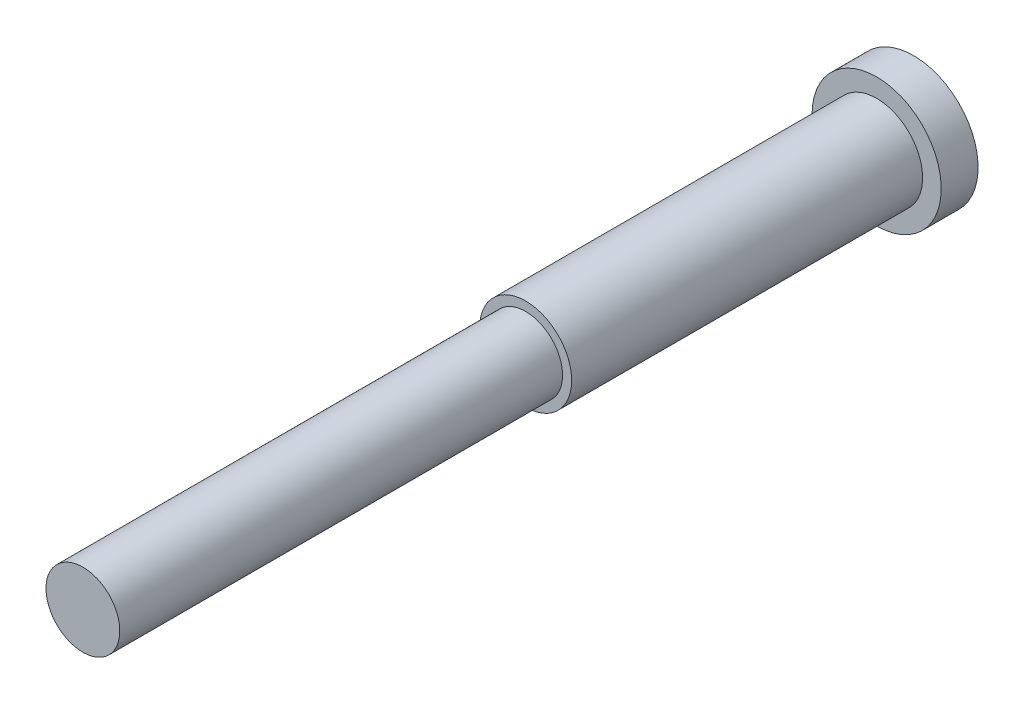
ISO-10303-21;
HEADER;
FILE_DESCRIPTION(('STEP AP214'),'2;1');
FILE_NAME('part.step','',(''),(''),'','','');
FILE_SCHEMA(('AUTOMOTIVE_DESIGN { 1 0 10303 214 1 1 1 1 }'));
ENDSEC;
DATA;
#1=APPLICATION_CONTEXT('core data for automotive mechanical design processes');
#2=APPLICATION_PROTOCOL_DEFINITION('international standard','automotive_design',2000,#1);
#3=PRODUCT_CONTEXT('',#1,'mechanical');
#4=PRODUCT('Part','Part','',(#3));
#5=PRODUCT_RELATED_PRODUCT_CATEGORY('part','',(#4));
#6=PRODUCT_DEFINITION_FORMATION('','',#4);
#7=PRODUCT_DEFINITION_CONTEXT('part definition',#1,'design');
#8=PRODUCT_DEFINITION('design','',#6,#7);
#9=PRODUCT_DEFINITION_SHAPE('','',#8);
#10=(LENGTH_UNIT() NAMED_UNIT(*) SI_UNIT(.MILLI.,.METRE.));
#11=(NAMED_UNIT(*) PLANE_ANGLE_UNIT() SI_UNIT($,.RADIAN.));
#12=(NAMED_UNIT(*) SI_UNIT($,.STERADIAN.) SOLID_ANGLE_UNIT());
#13=UNCERTAINTY_MEASURE_WITH_UNIT(LENGTH_MEASURE(1.E-05),#10,'distance_accuracy_value','');
#14=(GEOMETRIC_REPRESENTATION_CONTEXT(3) GLOBAL_UNCERTAINTY_ASSIGNED_CONTEXT((#13)) GLOBAL_UNIT_ASSIGNED_CONTEXT((#10,
#11,#12)) REPRESENTATION_CONTEXT('',''));
#15=CARTESIAN_POINT('',(0.,0.,0.));
#16=DIRECTION('',(0.,0.,1.));
#17=DIRECTION('',(1.,0.,0.));
#18=AXIS2_PLACEMENT_3D('',#15,#16,#17);
#19=CARTESIAN_POINT('',(0.,0.,60.4012));
#20=DIRECTION('',(0.,0.,1.));
#21=DIRECTION('',(1.,0.,0.));
#22=AXIS2_PLACEMENT_3D('',#19,#20,#21);
#23=PLANE('',#22);
#24=CARTESIAN_POINT('',(0.,0.,60.4012));
#25=DIRECTION('',(0.,0.,1.));
#26=DIRECTION('',(1.,0.,0.));
#27=AXIS2_PLACEMENT_3D('',#24,#25,#26);
#28=CIRCLE('',#27,7.9121);
#29=CARTESIAN_POINT('',(7.9121,0.,60.4012));
#30=VERTEX_POINT('',#29);
#31=EDGE_CURVE('E10',#30,#30,#28,.T.);
#32=ORIENTED_EDGE('',*,*,#31,.T.);
#33=EDGE_LOOP('',(#32));
#34=FACE_BOUND('',#33,.T.);
#35=CARTESIAN_POINT('',(0.,0.,60.4012));
#36=DIRECTION('',(0.,0.,1.));
#37=DIRECTION('',(1.,0.,0.));
#38=AXIS2_PLACEMENT_3D('',#35,#36,#37);
#39=CIRCLE('',#38,6.35);
#40=CARTESIAN_POINT('',(-6.35,0.,60.4012));
#41=VERTEX_POINT('',#40);
#42=EDGE_CURVE('E43',#41,#41,#39,.T.);
#43=ORIENTED_EDGE('',*,*,#42,.F.);
#44=EDGE_LOOP('',(#43));
#45=FACE_BOUND('',#44,.T.);
#46=ADVANCED_FACE('F32',(#34,#45),#23,.T.);
#47=CARTESIAN_POINT('',(0.,0.,60.4012));
#48=DIRECTION('',(0.,0.,-1.));
#49=DIRECTION('',(-1.,0.,0.));
#50=AXIS2_PLACEMENT_3D('',#47,#48,#49);
#51=CYLINDRICAL_SURFACE('',#50,7.9121);
#52=ORIENTED_EDGE('',*,*,#31,.F.);
#53=EDGE_LOOP('',(#52));
#54=FACE_BOUND('',#53,.T.);
#55=CARTESIAN_POINT('',(0.,0.,0.));
#56=DIRECTION('',(0.,0.,-1.));
#57=DIRECTION('',(-1.,0.,0.));
#58=AXIS2_PLACEMENT_3D('',#55,#56,#57);
#59=CIRCLE('',#58,7.9121);
#60=CARTESIAN_POINT('',(-7.9121,0.,0.));
#61=VERTEX_POINT('',#60);
#62=EDGE_CURVE('E48',#61,#61,#59,.T.);
#63=ORIENTED_EDGE('',*,*,#62,.F.);
#64=EDGE_LOOP('',(#63));
#65=FACE_BOUND('',#64,.T.);
#66=ADVANCED_FACE('F34',(#54,#65),#51,.T.);
#67=CARTESIAN_POINT('',(0.,0.,136.6012));
#68=DIRECTION('',(0.,0.,-1.));
#69=DIRECTION('',(-1.,0.,0.));
#70=AXIS2_PLACEMENT_3D('',#67,#68,#69);
#71=CYLINDRICAL_SURFACE('',#70,6.35);
#72=CARTESIAN_POINT('',(0.,0.,136.6012));
#73=DIRECTION('',(0.,0.,1.));
#74=DIRECTION('',(1.,0.,0.));
#75=AXIS2_PLACEMENT_3D('',#72,#73,#74);
#76=CIRCLE('',#75,6.35);
#77=CARTESIAN_POINT('',(-6.35,0.,136.6012));
#78=VERTEX_POINT('',#77);
#79=EDGE_CURVE('E39',#78,#78,#76,.T.);
#80=CARTESIAN_POINT('',(-6.35,0.,136.6012));
#81=CARTESIAN_POINT('',(-6.35,0.,135.80745));
#82=CARTESIAN_POINT('',(-6.35,0.,135.0137));
#83=CARTESIAN_POINT('',(-6.35,0.,133.4262));
#84=CARTESIAN_POINT('',(-6.35,0.,132.63245));
#85=CARTESIAN_POINT('',(-6.35,0.,131.04495));
#86=CARTESIAN_POINT('',(-6.35,0.,130.2512));
#87=CARTESIAN_POINT('',(-6.35,0.,128.6637));
#88=CARTESIAN_POINT('',(-6.35,0.,127.86995));
#89=CARTESIAN_POINT('',(-6.35,0.,126.28245));
#90=CARTESIAN_POINT('',(-6.35,0.,125.4887));
#91=CARTESIAN_POINT('',(-6.35,0.,123.9012));
#92=CARTESIAN_POINT('',(-6.35,0.,123.10745));
#93=CARTESIAN_POINT('',(-6.35,0.,121.51995));
#94=CARTESIAN_POINT('',(-6.35,0.,120.7262));
#95=CARTESIAN_POINT('',(-6.35,0.,119.1387));
#96=CARTESIAN_POINT('',(-6.35,0.,118.34495));
#97=CARTESIAN_POINT('',(-6.35,0.,116.75745));
#98=CARTESIAN_POINT('',(-6.35,0.,115.9637));
#99=CARTESIAN_POINT('',(-6.35,0.,114.3762));
#100=CARTESIAN_POINT('',(-6.35,0.,113.58245));
#101=CARTESIAN_POINT('',(-6.35,0.,111.99495));
#102=CARTESIAN_POINT('',(-6.35,0.,111.2012));
#103=CARTESIAN_POINT('',(-6.35,0.,109.6137));
#104=CARTESIAN_POINT('',(-6.35,0.,108.81995));
#105=CARTESIAN_POINT('',(-6.35,0.,107.23245));
#106=CARTESIAN_POINT('',(-6.35,0.,106.4387));
#107=CARTESIAN_POINT('',(-6.35,0.,104.8512));
#108=CARTESIAN_POINT('',(-6.35,0.,104.05745));
#109=CARTESIAN_POINT('',(-6.35,0.,102.46995));
#110=CARTESIAN_POINT('',(-6.35,0.,101.6762));
#111=CARTESIAN_POINT('',(-6.35,0.,100.0887));
#112=CARTESIAN_POINT('',(-6.35,0.,99.29495));
#113=CARTESIAN_POINT('',(-6.35,0.,97.70745));
#114=CARTESIAN_POINT('',(-6.35,0.,96.9137));
#115=CARTESIAN_POINT('',(-6.35,0.,95.3262));
#116=CARTESIAN_POINT('',(-6.35,0.,94.53245));
#117=CARTESIAN_POINT('',(-6.35,0.,92.94495));
#118=CARTESIAN_POINT('',(-6.35,0.,92.1512));
#119=CARTESIAN_POINT('',(-6.35,0.,90.5637));
#120=CARTESIAN_POINT('',(-6.35,0.,89.76995));
#121=CARTESIAN_POINT('',(-6.35,0.,88.18245));
#122=CARTESIAN_POINT('',(-6.35,0.,87.3887));
#123=CARTESIAN_POINT('',(-6.35,0.,85.8012));
#124=CARTESIAN_POINT('',(-6.35,0.,85.00745));
#125=CARTESIAN_POINT('',(-6.35,0.,83.41995));
#126=CARTESIAN_POINT('',(-6.35,0.,82.6262));
#127=CARTESIAN_POINT('',(-6.35,0.,81.0387));
#128=CARTESIAN_POINT('',(-6.35,0.,80.24495));
#129=CARTESIAN_POINT('',(-6.35,0.,78.65745));
#130=CARTESIAN_POINT('',(-6.35,0.,77.8637));
#131=CARTESIAN_POINT('',(-6.35,0.,76.2762));
#132=CARTESIAN_POINT('',(-6.35,0.,75.48245));
#133=CARTESIAN_POINT('',(-6.35,0.,73.89495));
#134=CARTESIAN_POINT('',(-6.35,0.,73.1012));
#135=CARTESIAN_POINT('',(-6.35,0.,71.5137));
#136=CARTESIAN_POINT('',(-6.35,0.,70.71995));
#137=CARTESIAN_POINT('',(-6.35,0.,69.13245));
#138=CARTESIAN_POINT('',(-6.35,0.,68.3387));
#139=CARTESIAN_POINT('',(-6.35,0.,66.7512));
#140=CARTESIAN_POINT('',(-6.35,0.,65.95745));
#141=CARTESIAN_POINT('',(-6.35,0.,64.36995));
#142=CARTESIAN_POINT('',(-6.35,0.,63.5762));
#143=CARTESIAN_POINT('',(-6.35,0.,61.9887));
#144=CARTESIAN_POINT('',(-6.35,0.,61.19495));
#145=CARTESIAN_POINT('',(-6.35,0.,60.4012));
#146=B_SPLINE_CURVE_WITH_KNOTS('',3,(#80,#81,#82,#83,#84,#85,#86,#87,#88,#89,#90,#91,#92,#93,
#94,#95,#96,#97,#98,#99,#100,#101,#102,#103,#104,#105,#106,#107,#108,#109,#110,#111,#112,#113,
#114,#115,#116,#117,#118,#119,#120,#121,#122,#123,#124,#125,#126,#127,#128,#129,#130,#131,#132,
#133,#134,#135,#136,#137,#138,#139,#140,#141,#142,#143,#144,#145),.UNSPECIFIED.,.F.,.F.,(4,2,2,
2,2,2,2,2,2,2,2,2,2,2,2,2,2,2,2,2,2,2,2,2,2,2,2,2,2,2,2,2,4),(0.,2.38124999999997,
4.76249999999998,7.14374999999998,9.52499999999998,11.90625,14.2875,16.66875,19.05,21.43125,
23.8125,26.19375,28.575,30.95625,33.3375,35.71875,38.1,40.48125,42.8625,45.24375,47.625,
50.00625,52.3875,54.76875,57.15,59.53125,61.9125,64.29375,66.675,69.05625,71.4375,73.81875,
76.2),.UNSPECIFIED.);
#147=EDGE_CURVE('BSEAM75',#78,#41,#146,.T.);
#148=ORIENTED_EDGE('',*,*,#79,.F.);
#149=ORIENTED_EDGE('',*,*,#42,.T.);
#150=ORIENTED_EDGE('',*,*,#147,.T.);
#151=ORIENTED_EDGE('',*,*,#147,.F.);
#152=EDGE_LOOP('',(#148,#150,#149,#151));
#153=FACE_BOUND('',#152,.T.);
#154=ADVANCED_FACE('F75',(#153),#71,.T.);
#155=CARTESIAN_POINT('',(0.,0.,136.6012));
#156=DIRECTION('',(0.,0.,1.));
#157=DIRECTION('',(1.,0.,0.));
#158=AXIS2_PLACEMENT_3D('',#155,#156,#157);
#159=PLANE('',#158);
#160=ORIENTED_EDGE('',*,*,#79,.T.);
#161=EDGE_LOOP('',(#160));
#162=FACE_BOUND('',#161,.T.);
#163=ADVANCED_FACE('F70',(#162),#159,.T.);
#164=CARTESIAN_POINT('',(0.,0.,0.));
#165=DIRECTION('',(0.,0.,-1.));
#166=DIRECTION('',(-1.,0.,0.));
#167=AXIS2_PLACEMENT_3D('',#164,#165,#166);
#168=PLANE('',#167);
#169=CARTESIAN_POINT('',(0.,0.,0.));
#170=DIRECTION('',(0.,0.,-1.));
#171=DIRECTION('',(-1.,0.,0.));
#172=AXIS2_PLACEMENT_3D('',#169,#170,#171);
#173=CIRCLE('',#172,11.1125);
#174=CARTESIAN_POINT('',(-11.1125,0.,0.));
#175=VERTEX_POINT('',#174);
#176=EDGE_CURVE('E53',#175,#175,#173,.T.);
#177=ORIENTED_EDGE('',*,*,#176,.F.);
#178=EDGE_LOOP('',(#177));
#179=FACE_BOUND('',#178,.T.);
#180=ORIENTED_EDGE('',*,*,#62,.T.);
#181=EDGE_LOOP('',(#180));
#182=FACE_BOUND('',#181,.T.);
#183=ADVANCED_FACE('F64',(#179,#182),#168,.F.);
#184=CARTESIAN_POINT('',(0.,0.,-6.35));
#185=DIRECTION('',(0.,0.,1.));
#186=DIRECTION('',(1.,0.,0.));
#187=AXIS2_PLACEMENT_3D('',#184,#185,#186);
#188=CYLINDRICAL_SURFACE('',#187,11.1125);
#189=CARTESIAN_POINT('',(0.,0.,-6.35));
#190=DIRECTION('',(0.,0.,-1.));
#191=DIRECTION('',(-1.,0.,0.));
#192=AXIS2_PLACEMENT_3D('',#189,#190,#191);
#193=CIRCLE('',#192,11.1125);
#194=CARTESIAN_POINT('',(-11.1125,0.,-6.35));
#195=VERTEX_POINT('',#194);
#196=EDGE_CURVE('E52',#195,#195,#193,.T.);
#197=ORIENTED_EDGE('',*,*,#196,.F.);
#198=EDGE_LOOP('',(#197));
#199=FACE_BOUND('',#198,.T.);
#200=ORIENTED_EDGE('',*,*,#176,.T.);
#201=EDGE_LOOP('',(#200));
#202=FACE_BOUND('',#201,.T.);
#203=ADVANCED_FACE('F61',(#199,#202),#188,.T.);
#204=CARTESIAN_POINT('',(0.,0.,-6.35));
#205=DIRECTION('',(0.,0.,-1.));
#206=DIRECTION('',(-1.,0.,0.));
#207=AXIS2_PLACEMENT_3D('',#204,#205,#206);
#208=PLANE('',#207);
#209=ORIENTED_EDGE('',*,*,#196,.T.);
#210=EDGE_LOOP('',(#209));
#211=FACE_BOUND('',#210,.T.);
#212=ADVANCED_FACE('F59',(#211),#208,.T.);
#213=CLOSED_SHELL('',(#46,#66,#154,#163,#183,#203,#212));
#214=MANIFOLD_SOLID_BREP('B2',#213);
#215=ADVANCED_BREP_SHAPE_REPRESENTATION('',(#18,#214),#14);
#216=SHAPE_DEFINITION_REPRESENTATION(#9,#215);
ENDSEC;
END-ISO-10303-21;
